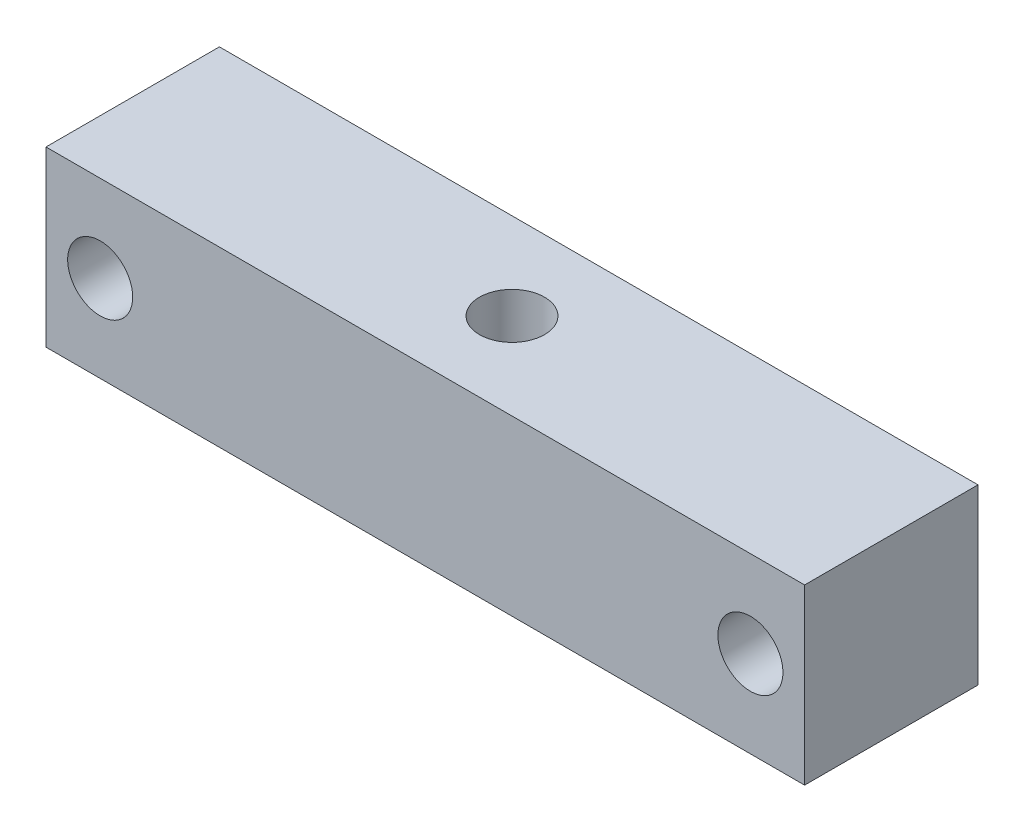
ISO-10303-21;
HEADER;
FILE_DESCRIPTION(('STEP AP214'),'2;1');
FILE_NAME('part.step','',(''),(''),'','','');
FILE_SCHEMA(('AUTOMOTIVE_DESIGN { 1 0 10303 214 1 1 1 1 }'));
ENDSEC;
DATA;
#1=APPLICATION_CONTEXT('core data for automotive mechanical design processes');
#2=APPLICATION_PROTOCOL_DEFINITION('international standard','automotive_design',2000,#1);
#3=PRODUCT_CONTEXT('',#1,'mechanical');
#4=PRODUCT('Part','Part','',(#3));
#5=PRODUCT_RELATED_PRODUCT_CATEGORY('part','',(#4));
#6=PRODUCT_DEFINITION_FORMATION('','',#4);
#7=PRODUCT_DEFINITION_CONTEXT('part definition',#1,'design');
#8=PRODUCT_DEFINITION('design','',#6,#7);
#9=PRODUCT_DEFINITION_SHAPE('','',#8);
#10=(LENGTH_UNIT() NAMED_UNIT(*) SI_UNIT(.MILLI.,.METRE.));
#11=(NAMED_UNIT(*) PLANE_ANGLE_UNIT() SI_UNIT($,.RADIAN.));
#12=(NAMED_UNIT(*) SI_UNIT($,.STERADIAN.) SOLID_ANGLE_UNIT());
#13=UNCERTAINTY_MEASURE_WITH_UNIT(LENGTH_MEASURE(1.E-05),#10,'distance_accuracy_value','');
#14=(GEOMETRIC_REPRESENTATION_CONTEXT(3) GLOBAL_UNCERTAINTY_ASSIGNED_CONTEXT((#13)) GLOBAL_UNIT_ASSIGNED_CONTEXT((#10,
#11,#12)) REPRESENTATION_CONTEXT('',''));
#15=CARTESIAN_POINT('',(0.,0.,0.));
#16=DIRECTION('',(0.,0.,1.));
#17=DIRECTION('',(1.,0.,0.));
#18=AXIS2_PLACEMENT_3D('',#15,#16,#17);
#19=CARTESIAN_POINT('',(17.5,4.,8.));
#20=DIRECTION('',(-1.,0.,0.));
#21=DIRECTION('',(0.,0.,1.));
#22=AXIS2_PLACEMENT_3D('',#19,#20,#21);
#23=PLANE('',#22);
#24=DIRECTION('',(0.,1.,0.));
#25=VECTOR('',#24,1.);
#26=CARTESIAN_POINT('',(17.5,4.,0.));
#27=LINE('',#26,#25);
#28=CARTESIAN_POINT('',(17.5,-4.,0.));
#29=VERTEX_POINT('',#28);
#30=CARTESIAN_POINT('',(17.5,4.,0.));
#31=VERTEX_POINT('',#30);
#32=EDGE_CURVE('E98',#29,#31,#27,.T.);
#33=ORIENTED_EDGE('',*,*,#32,.T.);
#34=DIRECTION('',(0.,0.,-1.));
#35=VECTOR('',#34,1.);
#36=CARTESIAN_POINT('',(17.5,4.,8.));
#37=LINE('',#36,#35);
#38=CARTESIAN_POINT('',(17.5,4.,8.));
#39=VERTEX_POINT('',#38);
#40=EDGE_CURVE('E11',#39,#31,#37,.T.);
#41=ORIENTED_EDGE('',*,*,#40,.F.);
#42=DIRECTION('',(0.,1.,0.));
#43=VECTOR('',#42,1.);
#44=CARTESIAN_POINT('',(17.5,4.,8.));
#45=LINE('',#44,#43);
#46=CARTESIAN_POINT('',(17.5,-4.,8.));
#47=VERTEX_POINT('',#46);
#48=EDGE_CURVE('E86',#47,#39,#45,.T.);
#49=ORIENTED_EDGE('',*,*,#48,.F.);
#50=DIRECTION('',(0.,0.,-1.));
#51=VECTOR('',#50,1.);
#52=CARTESIAN_POINT('',(17.5,-4.,8.));
#53=LINE('',#52,#51);
#54=EDGE_CURVE('E94',#47,#29,#53,.T.);
#55=ORIENTED_EDGE('',*,*,#54,.T.);
#56=EDGE_LOOP('',(#33,#41,#49,#55));
#57=FACE_BOUND('',#56,.T.);
#58=ADVANCED_FACE('F35',(#57),#23,.F.);
#59=CARTESIAN_POINT('',(-17.5,4.,8.));
#60=DIRECTION('',(0.,-1.,0.));
#61=DIRECTION('',(0.,0.,-1.));
#62=AXIS2_PLACEMENT_3D('',#59,#60,#61);
#63=PLANE('',#62);
#64=CARTESIAN_POINT('',(0.,4.,4.));
#65=DIRECTION('',(0.,1.,0.));
#66=DIRECTION('',(0.,0.,1.));
#67=AXIS2_PLACEMENT_3D('',#64,#65,#66);
#68=CIRCLE('',#67,1.5);
#69=CARTESIAN_POINT('',(0.,4.,5.5));
#70=VERTEX_POINT('',#69);
#71=EDGE_CURVE('E124',#70,#70,#68,.T.);
#72=ORIENTED_EDGE('',*,*,#71,.F.);
#73=EDGE_LOOP('',(#72));
#74=FACE_BOUND('',#73,.T.);
#75=DIRECTION('',(-1.,0.,0.));
#76=VECTOR('',#75,1.);
#77=CARTESIAN_POINT('',(-17.5,4.,0.));
#78=LINE('',#77,#76);
#79=CARTESIAN_POINT('',(-17.5,4.,0.));
#80=VERTEX_POINT('',#79);
#81=EDGE_CURVE('E90',#31,#80,#78,.T.);
#82=ORIENTED_EDGE('',*,*,#81,.T.);
#83=DIRECTION('',(0.,0.,-1.));
#84=VECTOR('',#83,1.);
#85=CARTESIAN_POINT('',(-17.5,4.,8.));
#86=LINE('',#85,#84);
#87=CARTESIAN_POINT('',(-17.5,4.,8.));
#88=VERTEX_POINT('',#87);
#89=EDGE_CURVE('E43',#88,#80,#86,.T.);
#90=ORIENTED_EDGE('',*,*,#89,.F.);
#91=DIRECTION('',(-1.,0.,0.));
#92=VECTOR('',#91,1.);
#93=CARTESIAN_POINT('',(-17.5,4.,8.));
#94=LINE('',#93,#92);
#95=EDGE_CURVE('E81',#39,#88,#94,.T.);
#96=ORIENTED_EDGE('',*,*,#95,.F.);
#97=ORIENTED_EDGE('',*,*,#40,.T.);
#98=EDGE_LOOP('',(#82,#90,#96,#97));
#99=FACE_BOUND('',#98,.T.);
#100=ADVANCED_FACE('F89',(#74,#99),#63,.F.);
#101=CARTESIAN_POINT('',(-17.5,4.,8.));
#102=DIRECTION('',(1.,0.,0.));
#103=DIRECTION('',(0.,0.,-1.));
#104=AXIS2_PLACEMENT_3D('',#101,#102,#103);
#105=PLANE('',#104);
#106=DIRECTION('',(0.,-1.,0.));
#107=VECTOR('',#106,1.);
#108=CARTESIAN_POINT('',(-17.5,4.,0.));
#109=LINE('',#108,#107);
#110=CARTESIAN_POINT('',(-17.5,-4.,0.));
#111=VERTEX_POINT('',#110);
#112=EDGE_CURVE('E68',#80,#111,#109,.T.);
#113=ORIENTED_EDGE('',*,*,#112,.T.);
#114=DIRECTION('',(0.,0.,-1.));
#115=VECTOR('',#114,1.);
#116=CARTESIAN_POINT('',(-17.5,-4.,8.));
#117=LINE('',#116,#115);
#118=CARTESIAN_POINT('',(-17.5,-4.,8.));
#119=VERTEX_POINT('',#118);
#120=EDGE_CURVE('E91',#119,#111,#117,.T.);
#121=ORIENTED_EDGE('',*,*,#120,.F.);
#122=DIRECTION('',(0.,-1.,0.));
#123=VECTOR('',#122,1.);
#124=CARTESIAN_POINT('',(-17.5,4.,8.));
#125=LINE('',#124,#123);
#126=EDGE_CURVE('E84',#88,#119,#125,.T.);
#127=ORIENTED_EDGE('',*,*,#126,.F.);
#128=ORIENTED_EDGE('',*,*,#89,.T.);
#129=EDGE_LOOP('',(#113,#121,#127,#128));
#130=FACE_BOUND('',#129,.T.);
#131=ADVANCED_FACE('F92',(#130),#105,.F.);
#132=CARTESIAN_POINT('',(-17.5,-4.,8.));
#133=DIRECTION('',(0.,1.,0.));
#134=DIRECTION('',(0.,0.,1.));
#135=AXIS2_PLACEMENT_3D('',#132,#133,#134);
#136=PLANE('',#135);
#137=CARTESIAN_POINT('',(0.,-4.,4.));
#138=DIRECTION('',(0.,1.,0.));
#139=DIRECTION('',(0.,0.,1.));
#140=AXIS2_PLACEMENT_3D('',#137,#138,#139);
#141=CIRCLE('',#140,1.5);
#142=CARTESIAN_POINT('',(0.,-4.,5.5));
#143=VERTEX_POINT('',#142);
#144=EDGE_CURVE('E116',#143,#143,#141,.T.);
#145=ORIENTED_EDGE('',*,*,#144,.T.);
#146=EDGE_LOOP('',(#145));
#147=FACE_BOUND('',#146,.T.);
#148=DIRECTION('',(1.,0.,0.));
#149=VECTOR('',#148,1.);
#150=CARTESIAN_POINT('',(-17.5,-4.,0.));
#151=LINE('',#150,#149);
#152=EDGE_CURVE('E74',#111,#29,#151,.T.);
#153=ORIENTED_EDGE('',*,*,#152,.T.);
#154=ORIENTED_EDGE('',*,*,#54,.F.);
#155=DIRECTION('',(1.,0.,0.));
#156=VECTOR('',#155,1.);
#157=CARTESIAN_POINT('',(-17.5,-4.,8.));
#158=LINE('',#157,#156);
#159=EDGE_CURVE('E51',#119,#47,#158,.T.);
#160=ORIENTED_EDGE('',*,*,#159,.F.);
#161=ORIENTED_EDGE('',*,*,#120,.T.);
#162=EDGE_LOOP('',(#153,#154,#160,#161));
#163=FACE_BOUND('',#162,.T.);
#164=ADVANCED_FACE('F106',(#147,#163),#136,.F.);
#165=CARTESIAN_POINT('',(0.,0.,8.));
#166=DIRECTION('',(0.,0.,1.));
#167=DIRECTION('',(1.,0.,0.));
#168=AXIS2_PLACEMENT_3D('',#165,#166,#167);
#169=PLANE('',#168);
#170=CARTESIAN_POINT('',(15.,0.,8.));
#171=DIRECTION('',(0.,0.,-1.));
#172=DIRECTION('',(-1.,0.,0.));
#173=AXIS2_PLACEMENT_3D('',#170,#171,#172);
#174=CIRCLE('',#173,1.5);
#175=CARTESIAN_POINT('',(13.5,0.,8.));
#176=VERTEX_POINT('',#175);
#177=EDGE_CURVE('E101',#176,#176,#174,.T.);
#178=ORIENTED_EDGE('',*,*,#177,.T.);
#179=EDGE_LOOP('',(#178));
#180=FACE_BOUND('',#179,.T.);
#181=CARTESIAN_POINT('',(-15.,0.,8.));
#182=DIRECTION('',(0.,0.,-1.));
#183=DIRECTION('',(1.,0.,0.));
#184=AXIS2_PLACEMENT_3D('',#181,#182,#183);
#185=CIRCLE('',#184,1.5);
#186=CARTESIAN_POINT('',(-13.5,0.,8.));
#187=VERTEX_POINT('',#186);
#188=EDGE_CURVE('E115',#187,#187,#185,.T.);
#189=ORIENTED_EDGE('',*,*,#188,.T.);
#190=EDGE_LOOP('',(#189));
#191=FACE_BOUND('',#190,.T.);
#192=ORIENTED_EDGE('',*,*,#48,.T.);
#193=ORIENTED_EDGE('',*,*,#95,.T.);
#194=ORIENTED_EDGE('',*,*,#126,.T.);
#195=ORIENTED_EDGE('',*,*,#159,.T.);
#196=EDGE_LOOP('',(#192,#193,#194,#195));
#197=FACE_BOUND('',#196,.T.);
#198=ADVANCED_FACE('F82',(#180,#191,#197),#169,.T.);
#199=CARTESIAN_POINT('',(0.,0.,0.));
#200=DIRECTION('',(0.,0.,1.));
#201=DIRECTION('',(1.,0.,0.));
#202=AXIS2_PLACEMENT_3D('',#199,#200,#201);
#203=PLANE('',#202);
#204=CARTESIAN_POINT('',(15.,0.,0.));
#205=DIRECTION('',(0.,0.,-1.));
#206=DIRECTION('',(-1.,0.,0.));
#207=AXIS2_PLACEMENT_3D('',#204,#205,#206);
#208=CIRCLE('',#207,1.5);
#209=CARTESIAN_POINT('',(13.5,0.,0.));
#210=VERTEX_POINT('',#209);
#211=EDGE_CURVE('E119',#210,#210,#208,.T.);
#212=ORIENTED_EDGE('',*,*,#211,.F.);
#213=EDGE_LOOP('',(#212));
#214=FACE_BOUND('',#213,.T.);
#215=CARTESIAN_POINT('',(-15.,0.,0.));
#216=DIRECTION('',(0.,0.,-1.));
#217=DIRECTION('',(1.,0.,0.));
#218=AXIS2_PLACEMENT_3D('',#215,#216,#217);
#219=CIRCLE('',#218,1.5);
#220=CARTESIAN_POINT('',(-13.5,0.,0.));
#221=VERTEX_POINT('',#220);
#222=EDGE_CURVE('E112',#221,#221,#219,.T.);
#223=ORIENTED_EDGE('',*,*,#222,.F.);
#224=EDGE_LOOP('',(#223));
#225=FACE_BOUND('',#224,.T.);
#226=ORIENTED_EDGE('',*,*,#32,.F.);
#227=ORIENTED_EDGE('',*,*,#152,.F.);
#228=ORIENTED_EDGE('',*,*,#112,.F.);
#229=ORIENTED_EDGE('',*,*,#81,.F.);
#230=EDGE_LOOP('',(#226,#227,#228,#229));
#231=FACE_BOUND('',#230,.T.);
#232=ADVANCED_FACE('F109',(#214,#225,#231),#203,.F.);
#233=CARTESIAN_POINT('',(-15.,0.,8.));
#234=DIRECTION('',(0.,0.,-1.));
#235=DIRECTION('',(-1.,0.,0.));
#236=AXIS2_PLACEMENT_3D('',#233,#234,#235);
#237=CYLINDRICAL_SURFACE('',#236,1.5);
#238=ORIENTED_EDGE('',*,*,#188,.F.);
#239=EDGE_LOOP('',(#238));
#240=FACE_BOUND('',#239,.T.);
#241=ORIENTED_EDGE('',*,*,#222,.T.);
#242=EDGE_LOOP('',(#241));
#243=FACE_BOUND('',#242,.T.);
#244=ADVANCED_FACE('F149',(#240,#243),#237,.F.);
#245=CARTESIAN_POINT('',(15.,0.,8.));
#246=DIRECTION('',(0.,0.,-1.));
#247=DIRECTION('',(-1.,0.,0.));
#248=AXIS2_PLACEMENT_3D('',#245,#246,#247);
#249=CYLINDRICAL_SURFACE('',#248,1.5);
#250=ORIENTED_EDGE('',*,*,#177,.F.);
#251=EDGE_LOOP('',(#250));
#252=FACE_BOUND('',#251,.T.);
#253=ORIENTED_EDGE('',*,*,#211,.T.);
#254=EDGE_LOOP('',(#253));
#255=FACE_BOUND('',#254,.T.);
#256=ADVANCED_FACE('F134',(#252,#255),#249,.F.);
#257=CARTESIAN_POINT('',(0.,-4.,4.));
#258=DIRECTION('',(0.,1.,0.));
#259=DIRECTION('',(0.,0.,1.));
#260=AXIS2_PLACEMENT_3D('',#257,#258,#259);
#261=CYLINDRICAL_SURFACE('',#260,1.5);
#262=ORIENTED_EDGE('',*,*,#144,.F.);
#263=EDGE_LOOP('',(#262));
#264=FACE_BOUND('',#263,.T.);
#265=ORIENTED_EDGE('',*,*,#71,.T.);
#266=EDGE_LOOP('',(#265));
#267=FACE_BOUND('',#266,.T.);
#268=ADVANCED_FACE('F131',(#264,#267),#261,.F.);
#269=CLOSED_SHELL('',(#58,#100,#131,#164,#198,#232,#244,#256,#268));
#270=MANIFOLD_SOLID_BREP('B2',#269);
#271=ADVANCED_BREP_SHAPE_REPRESENTATION('',(#18,#270),#14);
#272=SHAPE_DEFINITION_REPRESENTATION(#9,#271);
ENDSEC;
END-ISO-10303-21;
